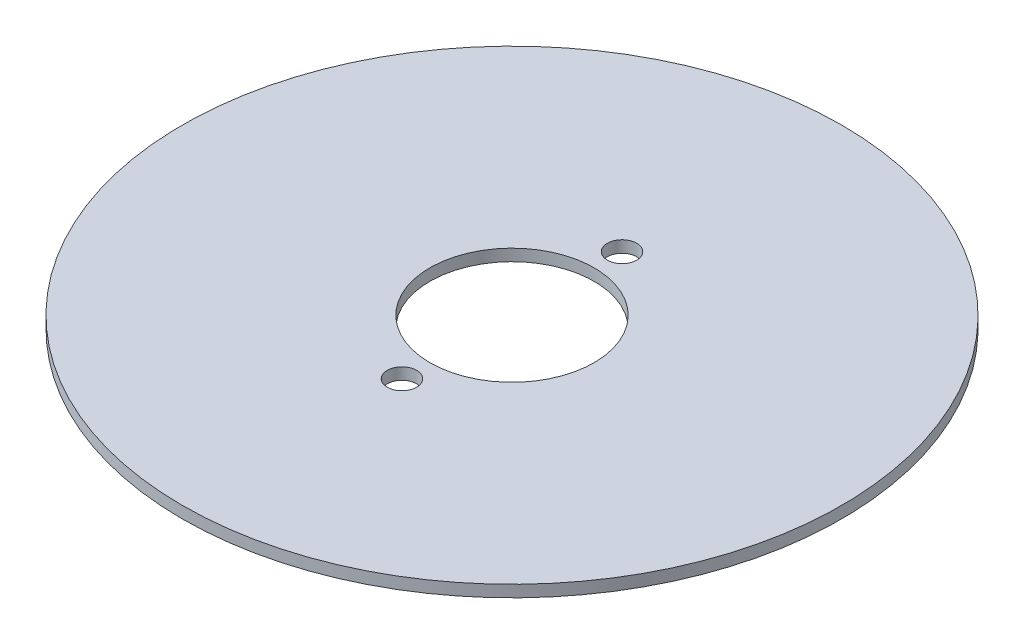
ISO-10303-21;
HEADER;
FILE_DESCRIPTION(('STEP AP214'),'2;1');
FILE_NAME('part.step','',(''),(''),'','','');
FILE_SCHEMA(('AUTOMOTIVE_DESIGN { 1 0 10303 214 1 1 1 1 }'));
ENDSEC;
DATA;
#1=APPLICATION_CONTEXT('core data for automotive mechanical design processes');
#2=APPLICATION_PROTOCOL_DEFINITION('international standard','automotive_design',2000,#1);
#3=PRODUCT_CONTEXT('',#1,'mechanical');
#4=PRODUCT('Part','Part','',(#3));
#5=PRODUCT_RELATED_PRODUCT_CATEGORY('part','',(#4));
#6=PRODUCT_DEFINITION_FORMATION('','',#4);
#7=PRODUCT_DEFINITION_CONTEXT('part definition',#1,'design');
#8=PRODUCT_DEFINITION('design','',#6,#7);
#9=PRODUCT_DEFINITION_SHAPE('','',#8);
#10=(LENGTH_UNIT() NAMED_UNIT(*) SI_UNIT(.MILLI.,.METRE.));
#11=(NAMED_UNIT(*) PLANE_ANGLE_UNIT() SI_UNIT($,.RADIAN.));
#12=(NAMED_UNIT(*) SI_UNIT($,.STERADIAN.) SOLID_ANGLE_UNIT());
#13=UNCERTAINTY_MEASURE_WITH_UNIT(LENGTH_MEASURE(1.E-05),#10,'distance_accuracy_value','');
#14=(GEOMETRIC_REPRESENTATION_CONTEXT(3) GLOBAL_UNCERTAINTY_ASSIGNED_CONTEXT((#13)) GLOBAL_UNIT_ASSIGNED_CONTEXT((#10,
#11,#12)) REPRESENTATION_CONTEXT('',''));
#15=CARTESIAN_POINT('',(0.,0.,0.));
#16=DIRECTION('',(0.,0.,1.));
#17=DIRECTION('',(1.,0.,0.));
#18=AXIS2_PLACEMENT_3D('',#15,#16,#17);
#19=CARTESIAN_POINT('',(0.,2.,0.));
#20=DIRECTION('',(0.,1.,0.));
#21=DIRECTION('',(0.,0.,1.));
#22=AXIS2_PLACEMENT_3D('',#19,#20,#21);
#23=PLANE('',#22);
#24=CARTESIAN_POINT('',(0.,2.,18.75));
#25=DIRECTION('',(0.,1.,0.));
#26=DIRECTION('',(0.,0.,1.));
#27=AXIS2_PLACEMENT_3D('',#24,#25,#26);
#28=CIRCLE('',#27,2.5);
#29=CARTESIAN_POINT('',(0.,2.,21.25));
#30=VERTEX_POINT('',#29);
#31=EDGE_CURVE('E49',#30,#30,#28,.T.);
#32=ORIENTED_EDGE('',*,*,#31,.F.);
#33=EDGE_LOOP('',(#32));
#34=FACE_BOUND('',#33,.T.);
#35=CARTESIAN_POINT('',(0.,2.,0.));
#36=DIRECTION('',(0.,1.,0.));
#37=DIRECTION('',(0.,0.,1.));
#38=AXIS2_PLACEMENT_3D('',#35,#36,#37);
#39=CIRCLE('',#38,56.15);
#40=CARTESIAN_POINT('',(0.,2.,56.15));
#41=VERTEX_POINT('',#40);
#42=EDGE_CURVE('E10',#41,#41,#39,.T.);
#43=ORIENTED_EDGE('',*,*,#42,.T.);
#44=EDGE_LOOP('',(#43));
#45=FACE_BOUND('',#44,.T.);
#46=CARTESIAN_POINT('',(0.,2.,-18.75));
#47=DIRECTION('',(0.,1.,0.));
#48=DIRECTION('',(0.,0.,1.));
#49=AXIS2_PLACEMENT_3D('',#46,#47,#48);
#50=CIRCLE('',#49,2.5);
#51=CARTESIAN_POINT('',(0.,2.,-16.25));
#52=VERTEX_POINT('',#51);
#53=EDGE_CURVE('E44',#52,#52,#50,.T.);
#54=ORIENTED_EDGE('',*,*,#53,.F.);
#55=EDGE_LOOP('',(#54));
#56=FACE_BOUND('',#55,.T.);
#57=CARTESIAN_POINT('',(0.,2.,0.));
#58=DIRECTION('',(0.,1.,0.));
#59=DIRECTION('',(0.,0.,1.));
#60=AXIS2_PLACEMENT_3D('',#57,#58,#59);
#61=CIRCLE('',#60,14.);
#62=CARTESIAN_POINT('',(0.,2.,14.));
#63=VERTEX_POINT('',#62);
#64=EDGE_CURVE('E55',#63,#63,#61,.T.);
#65=ORIENTED_EDGE('',*,*,#64,.F.);
#66=EDGE_LOOP('',(#65));
#67=FACE_BOUND('',#66,.T.);
#68=ADVANCED_FACE('F33',(#34,#45,#56,#67),#23,.T.);
#69=CARTESIAN_POINT('',(0.,0.,0.));
#70=DIRECTION('',(0.,1.,0.));
#71=DIRECTION('',(0.,0.,1.));
#72=AXIS2_PLACEMENT_3D('',#69,#70,#71);
#73=PLANE('',#72);
#74=CARTESIAN_POINT('',(0.,0.,0.));
#75=DIRECTION('',(0.,1.,0.));
#76=DIRECTION('',(0.,0.,1.));
#77=AXIS2_PLACEMENT_3D('',#74,#75,#76);
#78=CIRCLE('',#77,56.15);
#79=CARTESIAN_POINT('',(0.,0.,56.15));
#80=VERTEX_POINT('',#79);
#81=EDGE_CURVE('E37',#80,#80,#78,.T.);
#82=ORIENTED_EDGE('',*,*,#81,.F.);
#83=EDGE_LOOP('',(#82));
#84=FACE_BOUND('',#83,.T.);
#85=CARTESIAN_POINT('',(0.,0.,-18.75));
#86=DIRECTION('',(0.,1.,0.));
#87=DIRECTION('',(0.,0.,1.));
#88=AXIS2_PLACEMENT_3D('',#85,#86,#87);
#89=CIRCLE('',#88,2.5);
#90=CARTESIAN_POINT('',(0.,0.,-16.25));
#91=VERTEX_POINT('',#90);
#92=EDGE_CURVE('E46',#91,#91,#89,.T.);
#93=ORIENTED_EDGE('',*,*,#92,.T.);
#94=EDGE_LOOP('',(#93));
#95=FACE_BOUND('',#94,.T.);
#96=CARTESIAN_POINT('',(0.,0.,18.75));
#97=DIRECTION('',(0.,1.,0.));
#98=DIRECTION('',(0.,0.,1.));
#99=AXIS2_PLACEMENT_3D('',#96,#97,#98);
#100=CIRCLE('',#99,2.5);
#101=CARTESIAN_POINT('',(0.,0.,21.25));
#102=VERTEX_POINT('',#101);
#103=EDGE_CURVE('E52',#102,#102,#100,.T.);
#104=ORIENTED_EDGE('',*,*,#103,.T.);
#105=EDGE_LOOP('',(#104));
#106=FACE_BOUND('',#105,.T.);
#107=CARTESIAN_POINT('',(0.,0.,0.));
#108=DIRECTION('',(0.,1.,0.));
#109=DIRECTION('',(0.,0.,1.));
#110=AXIS2_PLACEMENT_3D('',#107,#108,#109);
#111=CIRCLE('',#110,14.);
#112=CARTESIAN_POINT('',(0.,0.,14.));
#113=VERTEX_POINT('',#112);
#114=EDGE_CURVE('E58',#113,#113,#111,.T.);
#115=ORIENTED_EDGE('',*,*,#114,.T.);
#116=EDGE_LOOP('',(#115));
#117=FACE_BOUND('',#116,.T.);
#118=ADVANCED_FACE('F68',(#84,#95,#106,#117),#73,.F.);
#119=CARTESIAN_POINT('',(0.,2.,0.));
#120=DIRECTION('',(0.,-1.,0.));
#121=DIRECTION('',(0.,0.,-1.));
#122=AXIS2_PLACEMENT_3D('',#119,#120,#121);
#123=CYLINDRICAL_SURFACE('',#122,56.15);
#124=ORIENTED_EDGE('',*,*,#42,.F.);
#125=EDGE_LOOP('',(#124));
#126=FACE_BOUND('',#125,.T.);
#127=ORIENTED_EDGE('',*,*,#81,.T.);
#128=EDGE_LOOP('',(#127));
#129=FACE_BOUND('',#128,.T.);
#130=ADVANCED_FACE('F35',(#126,#129),#123,.T.);
#131=CARTESIAN_POINT('',(0.,2.,-18.75));
#132=DIRECTION('',(0.,-1.,0.));
#133=DIRECTION('',(0.,0.,-1.));
#134=AXIS2_PLACEMENT_3D('',#131,#132,#133);
#135=CYLINDRICAL_SURFACE('',#134,2.5);
#136=ORIENTED_EDGE('',*,*,#53,.T.);
#137=EDGE_LOOP('',(#136));
#138=FACE_BOUND('',#137,.T.);
#139=ORIENTED_EDGE('',*,*,#92,.F.);
#140=EDGE_LOOP('',(#139));
#141=FACE_BOUND('',#140,.T.);
#142=ADVANCED_FACE('F77',(#138,#141),#135,.F.);
#143=CARTESIAN_POINT('',(0.,2.,18.75));
#144=DIRECTION('',(0.,-1.,0.));
#145=DIRECTION('',(0.,0.,-1.));
#146=AXIS2_PLACEMENT_3D('',#143,#144,#145);
#147=CYLINDRICAL_SURFACE('',#146,2.5);
#148=ORIENTED_EDGE('',*,*,#31,.T.);
#149=EDGE_LOOP('',(#148));
#150=FACE_BOUND('',#149,.T.);
#151=ORIENTED_EDGE('',*,*,#103,.F.);
#152=EDGE_LOOP('',(#151));
#153=FACE_BOUND('',#152,.T.);
#154=ADVANCED_FACE('F80',(#150,#153),#147,.F.);
#155=CARTESIAN_POINT('',(0.,2.,0.));
#156=DIRECTION('',(0.,-1.,0.));
#157=DIRECTION('',(0.,0.,-1.));
#158=AXIS2_PLACEMENT_3D('',#155,#156,#157);
#159=CYLINDRICAL_SURFACE('',#158,14.);
#160=ORIENTED_EDGE('',*,*,#64,.T.);
#161=EDGE_LOOP('',(#160));
#162=FACE_BOUND('',#161,.T.);
#163=ORIENTED_EDGE('',*,*,#114,.F.);
#164=EDGE_LOOP('',(#163));
#165=FACE_BOUND('',#164,.T.);
#166=ADVANCED_FACE('F64',(#162,#165),#159,.F.);
#167=CLOSED_SHELL('',(#68,#118,#130,#142,#154,#166));
#168=MANIFOLD_SOLID_BREP('B2',#167);
#169=ADVANCED_BREP_SHAPE_REPRESENTATION('',(#18,#168),#14);
#170=SHAPE_DEFINITION_REPRESENTATION(#9,#169);
ENDSEC;
END-ISO-10303-21;
